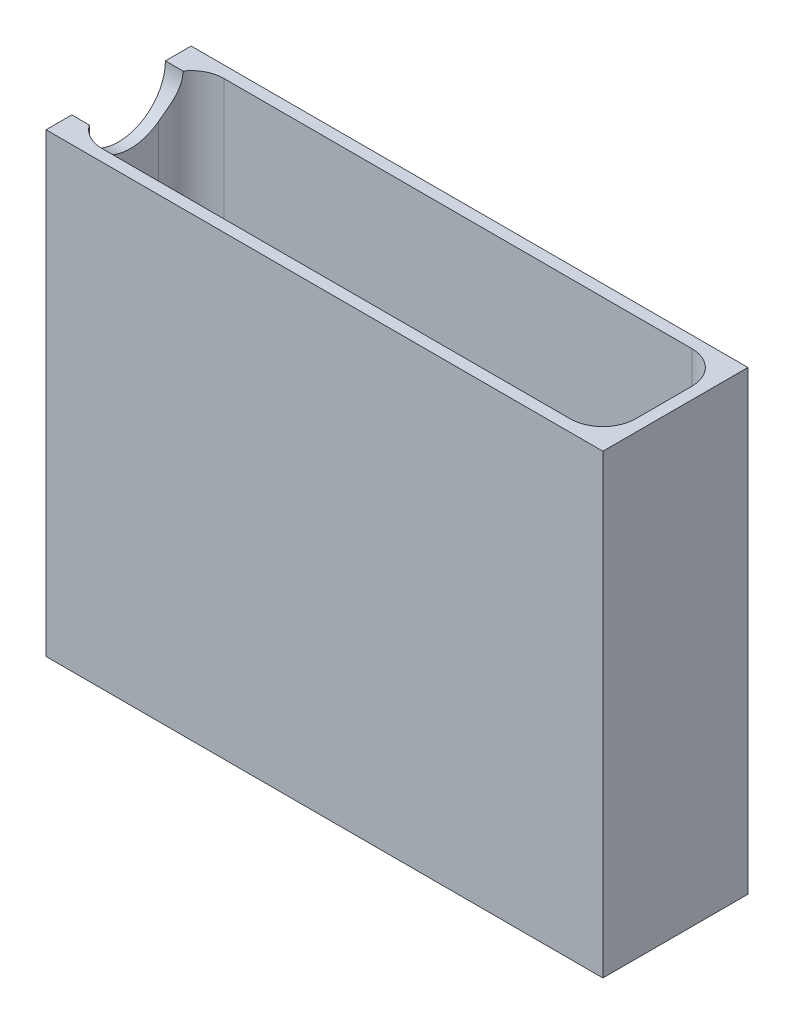
ISO-10303-21;
HEADER;
FILE_DESCRIPTION(('STEP AP214'),'2;1');
FILE_NAME('part.step','',(''),(''),'','','');
FILE_SCHEMA(('AUTOMOTIVE_DESIGN { 1 0 10303 214 1 1 1 1 }'));
ENDSEC;
DATA;
#1=APPLICATION_CONTEXT('core data for automotive mechanical design processes');
#2=APPLICATION_PROTOCOL_DEFINITION('international standard','automotive_design',2000,#1);
#3=PRODUCT_CONTEXT('',#1,'mechanical');
#4=PRODUCT('Part','Part','',(#3));
#5=PRODUCT_RELATED_PRODUCT_CATEGORY('part','',(#4));
#6=PRODUCT_DEFINITION_FORMATION('','',#4);
#7=PRODUCT_DEFINITION_CONTEXT('part definition',#1,'design');
#8=PRODUCT_DEFINITION('design','',#6,#7);
#9=PRODUCT_DEFINITION_SHAPE('','',#8);
#10=(LENGTH_UNIT() NAMED_UNIT(*) SI_UNIT(.MILLI.,.METRE.));
#11=(NAMED_UNIT(*) PLANE_ANGLE_UNIT() SI_UNIT($,.RADIAN.));
#12=(NAMED_UNIT(*) SI_UNIT($,.STERADIAN.) SOLID_ANGLE_UNIT());
#13=UNCERTAINTY_MEASURE_WITH_UNIT(LENGTH_MEASURE(1.E-05),#10,'distance_accuracy_value','');
#14=(GEOMETRIC_REPRESENTATION_CONTEXT(3) GLOBAL_UNCERTAINTY_ASSIGNED_CONTEXT((#13)) GLOBAL_UNIT_ASSIGNED_CONTEXT((#10,
#11,#12)) REPRESENTATION_CONTEXT('',''));
#15=CARTESIAN_POINT('',(0.,0.,0.));
#16=DIRECTION('',(0.,0.,1.));
#17=DIRECTION('',(1.,0.,0.));
#18=AXIS2_PLACEMENT_3D('',#15,#16,#17);
#19=CARTESIAN_POINT('',(0.,95.,0.));
#20=DIRECTION('',(0.,1.,0.));
#21=DIRECTION('',(0.,0.,1.));
#22=AXIS2_PLACEMENT_3D('',#19,#20,#21);
#23=PLANE('',#22);
#24=DIRECTION('',(1.,0.,0.));
#25=VECTOR('',#24,1.);
#26=CARTESIAN_POINT('',(0.,95.,26.));
#27=LINE('',#26,#25);
#28=CARTESIAN_POINT('',(-107.,95.,26.));
#29=VERTEX_POINT('',#28);
#30=CARTESIAN_POINT('',(-6.99999999999999,95.,26.));
#31=VERTEX_POINT('',#30);
#32=EDGE_CURVE('E198',#29,#31,#27,.T.);
#33=ORIENTED_EDGE('',*,*,#32,.F.);
#34=CARTESIAN_POINT('',(-107.,95.,19.));
#35=DIRECTION('',(0.,1.,0.));
#36=DIRECTION('',(0.,0.,1.));
#37=AXIS2_PLACEMENT_3D('',#34,#35,#36);
#38=CIRCLE('',#37,7.);
#39=CARTESIAN_POINT('',(-112.744562646538,95.,23.));
#40=VERTEX_POINT('',#39);
#41=EDGE_CURVE('E256',#29,#40,#38,.F.);
#42=ORIENTED_EDGE('',*,*,#41,.T.);
#43=DIRECTION('',(1.,0.,0.));
#44=VECTOR('',#43,1.);
#45=CARTESIAN_POINT('',(-461.417379105192,95.,23.));
#46=LINE('',#45,#44);
#47=CARTESIAN_POINT('',(-116.5,95.,23.));
#48=VERTEX_POINT('',#47);
#49=EDGE_CURVE('E80',#48,#40,#46,.T.);
#50=ORIENTED_EDGE('',*,*,#49,.F.);
#51=DIRECTION('',(0.,0.,1.));
#52=VECTOR('',#51,1.);
#53=CARTESIAN_POINT('',(-116.5,95.,0.));
#54=LINE('',#53,#52);
#55=CARTESIAN_POINT('',(-116.5,95.,28.5));
#56=VERTEX_POINT('',#55);
#57=EDGE_CURVE('E216',#48,#56,#54,.T.);
#58=ORIENTED_EDGE('',*,*,#57,.T.);
#59=DIRECTION('',(1.,0.,0.));
#60=VECTOR('',#59,1.);
#61=CARTESIAN_POINT('',(0.,95.,28.5));
#62=LINE('',#61,#60);
#63=CARTESIAN_POINT('',(2.5,95.,28.5));
#64=VERTEX_POINT('',#63);
#65=EDGE_CURVE('E218',#56,#64,#62,.T.);
#66=ORIENTED_EDGE('',*,*,#65,.T.);
#67=DIRECTION('',(0.,0.,-1.));
#68=VECTOR('',#67,1.);
#69=CARTESIAN_POINT('',(2.5,95.,0.));
#70=LINE('',#69,#68);
#71=CARTESIAN_POINT('',(2.5,95.,-2.5));
#72=VERTEX_POINT('',#71);
#73=EDGE_CURVE('E201',#64,#72,#70,.T.);
#74=ORIENTED_EDGE('',*,*,#73,.T.);
#75=DIRECTION('',(-1.,0.,0.));
#76=VECTOR('',#75,1.);
#77=CARTESIAN_POINT('',(0.,95.,-2.5));
#78=LINE('',#77,#76);
#79=CARTESIAN_POINT('',(-116.5,95.,-2.49999999999999));
#80=VERTEX_POINT('',#79);
#81=EDGE_CURVE('E214',#72,#80,#78,.T.);
#82=ORIENTED_EDGE('',*,*,#81,.T.);
#83=CARTESIAN_POINT('',(-116.5,95.,3.00000000000002));
#84=VERTEX_POINT('',#83);
#85=EDGE_CURVE('E166',#80,#84,#54,.T.);
#86=ORIENTED_EDGE('',*,*,#85,.T.);
#87=DIRECTION('',(1.,0.,0.));
#88=VECTOR('',#87,1.);
#89=CARTESIAN_POINT('',(-461.417379105192,95.,3.00000000000002));
#90=LINE('',#89,#88);
#91=CARTESIAN_POINT('',(-112.744562646538,95.,3.00000000000002));
#92=VERTEX_POINT('',#91);
#93=EDGE_CURVE('E72',#84,#92,#90,.T.);
#94=ORIENTED_EDGE('',*,*,#93,.T.);
#95=CARTESIAN_POINT('',(-107.,95.,7.00000000000001));
#96=DIRECTION('',(0.,1.,0.));
#97=DIRECTION('',(0.,0.,1.));
#98=AXIS2_PLACEMENT_3D('',#95,#96,#97);
#99=CIRCLE('',#98,7.);
#100=CARTESIAN_POINT('',(-107.,95.,0.));
#101=VERTEX_POINT('',#100);
#102=EDGE_CURVE('E12',#92,#101,#99,.F.);
#103=ORIENTED_EDGE('',*,*,#102,.T.);
#104=DIRECTION('',(-1.,0.,0.));
#105=VECTOR('',#104,1.);
#106=CARTESIAN_POINT('',(0.,95.,0.));
#107=LINE('',#106,#105);
#108=CARTESIAN_POINT('',(-7.,95.,0.));
#109=VERTEX_POINT('',#108);
#110=EDGE_CURVE('E194',#109,#101,#107,.T.);
#111=ORIENTED_EDGE('',*,*,#110,.F.);
#112=CARTESIAN_POINT('',(-7.,95.,7.));
#113=DIRECTION('',(0.,1.,0.));
#114=DIRECTION('',(0.,0.,1.));
#115=AXIS2_PLACEMENT_3D('',#112,#113,#114);
#116=CIRCLE('',#115,7.);
#117=CARTESIAN_POINT('',(0.,95.,7.));
#118=VERTEX_POINT('',#117);
#119=EDGE_CURVE('E254',#109,#118,#116,.F.);
#120=ORIENTED_EDGE('',*,*,#119,.T.);
#121=DIRECTION('',(0.,0.,-1.));
#122=VECTOR('',#121,1.);
#123=CARTESIAN_POINT('',(0.,95.,0.));
#124=LINE('',#123,#122);
#125=CARTESIAN_POINT('',(0.,95.,19.));
#126=VERTEX_POINT('',#125);
#127=EDGE_CURVE('E191',#126,#118,#124,.T.);
#128=ORIENTED_EDGE('',*,*,#127,.F.);
#129=CARTESIAN_POINT('',(-7.,95.,19.));
#130=DIRECTION('',(0.,1.,0.));
#131=DIRECTION('',(0.,0.,1.));
#132=AXIS2_PLACEMENT_3D('',#129,#130,#131);
#133=CIRCLE('',#132,7.);
#134=EDGE_CURVE('E252',#126,#31,#133,.F.);
#135=ORIENTED_EDGE('',*,*,#134,.T.);
#136=EDGE_LOOP('',(#33,#42,#50,#58,#66,#74,#82,#86,#94,#103,#111,#120,#128,#135));
#137=FACE_BOUND('',#136,.T.);
#138=ADVANCED_FACE('F57',(#137),#23,.T.);
#139=CARTESIAN_POINT('',(-116.5,95.,0.));
#140=DIRECTION('',(1.,0.,0.));
#141=DIRECTION('',(0.,0.,-1.));
#142=AXIS2_PLACEMENT_3D('',#139,#140,#141);
#143=PLANE('',#142);
#144=CARTESIAN_POINT('',(-116.5,95.,13.));
#145=DIRECTION('',(1.,0.,0.));
#146=DIRECTION('',(0.,0.,-1.));
#147=AXIS2_PLACEMENT_3D('',#144,#145,#146);
#148=CIRCLE('',#147,10.);
#149=EDGE_CURVE('E339',#48,#84,#148,.T.);
#150=ORIENTED_EDGE('',*,*,#149,.T.);
#151=ORIENTED_EDGE('',*,*,#85,.F.);
#152=DIRECTION('',(0.,-1.,0.));
#153=VECTOR('',#152,1.);
#154=CARTESIAN_POINT('',(-116.5,95.,-2.49999999999999));
#155=LINE('',#154,#153);
#156=CARTESIAN_POINT('',(-116.5,-2.5,-2.5));
#157=VERTEX_POINT('',#156);
#158=EDGE_CURVE('E160',#80,#157,#155,.T.);
#159=ORIENTED_EDGE('',*,*,#158,.T.);
#160=DIRECTION('',(0.,0.,-1.));
#161=VECTOR('',#160,1.);
#162=CARTESIAN_POINT('',(-116.5,-2.5,28.5));
#163=LINE('',#162,#161);
#164=CARTESIAN_POINT('',(-116.5,-2.5,28.5));
#165=VERTEX_POINT('',#164);
#166=EDGE_CURVE('E165',#165,#157,#163,.T.);
#167=ORIENTED_EDGE('',*,*,#166,.F.);
#168=DIRECTION('',(0.,-1.,0.));
#169=VECTOR('',#168,1.);
#170=CARTESIAN_POINT('',(-116.5,95.,28.5));
#171=LINE('',#170,#169);
#172=EDGE_CURVE('E169',#56,#165,#171,.T.);
#173=ORIENTED_EDGE('',*,*,#172,.F.);
#174=ORIENTED_EDGE('',*,*,#57,.F.);
#175=EDGE_LOOP('',(#150,#151,#159,#167,#173,#174));
#176=FACE_BOUND('',#175,.T.);
#177=ADVANCED_FACE('F162',(#176),#143,.F.);
#178=CARTESIAN_POINT('',(2.5,95.,0.));
#179=DIRECTION('',(-1.,0.,0.));
#180=DIRECTION('',(0.,0.,1.));
#181=AXIS2_PLACEMENT_3D('',#178,#179,#180);
#182=PLANE('',#181);
#183=DIRECTION('',(0.,-1.,0.));
#184=VECTOR('',#183,1.);
#185=CARTESIAN_POINT('',(2.5,95.,28.5));
#186=LINE('',#185,#184);
#187=CARTESIAN_POINT('',(2.5,-2.5,28.5));
#188=VERTEX_POINT('',#187);
#189=EDGE_CURVE('E220',#64,#188,#186,.T.);
#190=ORIENTED_EDGE('',*,*,#189,.T.);
#191=DIRECTION('',(0.,0.,1.));
#192=VECTOR('',#191,1.);
#193=CARTESIAN_POINT('',(2.5,-2.5,28.5));
#194=LINE('',#193,#192);
#195=CARTESIAN_POINT('',(2.5,-2.5,-2.5));
#196=VERTEX_POINT('',#195);
#197=EDGE_CURVE('E178',#196,#188,#194,.T.);
#198=ORIENTED_EDGE('',*,*,#197,.F.);
#199=DIRECTION('',(0.,-1.,0.));
#200=VECTOR('',#199,1.);
#201=CARTESIAN_POINT('',(2.5,95.,-2.5));
#202=LINE('',#201,#200);
#203=EDGE_CURVE('E168',#72,#196,#202,.T.);
#204=ORIENTED_EDGE('',*,*,#203,.F.);
#205=ORIENTED_EDGE('',*,*,#73,.F.);
#206=EDGE_LOOP('',(#190,#198,#204,#205));
#207=FACE_BOUND('',#206,.T.);
#208=ADVANCED_FACE('F307',(#207),#182,.F.);
#209=CARTESIAN_POINT('',(0.,95.,-2.5));
#210=DIRECTION('',(0.,0.,1.));
#211=DIRECTION('',(1.,0.,0.));
#212=AXIS2_PLACEMENT_3D('',#209,#210,#211);
#213=PLANE('',#212);
#214=ORIENTED_EDGE('',*,*,#203,.T.);
#215=DIRECTION('',(1.,0.,0.));
#216=VECTOR('',#215,1.);
#217=CARTESIAN_POINT('',(-116.5,-2.5,-2.5));
#218=LINE('',#217,#216);
#219=EDGE_CURVE('E172',#157,#196,#218,.T.);
#220=ORIENTED_EDGE('',*,*,#219,.F.);
#221=ORIENTED_EDGE('',*,*,#158,.F.);
#222=ORIENTED_EDGE('',*,*,#81,.F.);
#223=EDGE_LOOP('',(#214,#220,#221,#222));
#224=FACE_BOUND('',#223,.T.);
#225=ADVANCED_FACE('F173',(#224),#213,.F.);
#226=CARTESIAN_POINT('',(0.,95.,28.5));
#227=DIRECTION('',(0.,0.,-1.));
#228=DIRECTION('',(-1.,0.,0.));
#229=AXIS2_PLACEMENT_3D('',#226,#227,#228);
#230=PLANE('',#229);
#231=ORIENTED_EDGE('',*,*,#172,.T.);
#232=DIRECTION('',(-1.,0.,0.));
#233=VECTOR('',#232,1.);
#234=CARTESIAN_POINT('',(-116.5,-2.5,28.5));
#235=LINE('',#234,#233);
#236=EDGE_CURVE('E183',#188,#165,#235,.T.);
#237=ORIENTED_EDGE('',*,*,#236,.F.);
#238=ORIENTED_EDGE('',*,*,#189,.F.);
#239=ORIENTED_EDGE('',*,*,#65,.F.);
#240=EDGE_LOOP('',(#231,#237,#238,#239));
#241=FACE_BOUND('',#240,.T.);
#242=ADVANCED_FACE('F298',(#241),#230,.F.);
#243=CARTESIAN_POINT('',(0.,95.,0.));
#244=DIRECTION('',(-1.,0.,0.));
#245=DIRECTION('',(0.,0.,1.));
#246=AXIS2_PLACEMENT_3D('',#243,#244,#245);
#247=PLANE('',#246);
#248=DIRECTION('',(0.,0.,-1.));
#249=VECTOR('',#248,1.);
#250=CARTESIAN_POINT('',(0.,0.,0.));
#251=LINE('',#250,#249);
#252=CARTESIAN_POINT('',(0.,0.,19.));
#253=VERTEX_POINT('',#252);
#254=CARTESIAN_POINT('',(0.,0.,7.));
#255=VERTEX_POINT('',#254);
#256=EDGE_CURVE('E190',#253,#255,#251,.T.);
#257=ORIENTED_EDGE('',*,*,#256,.F.);
#258=DIRECTION('',(0.,-1.,0.));
#259=VECTOR('',#258,1.);
#260=CARTESIAN_POINT('',(0.,95.,19.));
#261=LINE('',#260,#259);
#262=EDGE_CURVE('E240',#253,#126,#261,.F.);
#263=ORIENTED_EDGE('',*,*,#262,.T.);
#264=ORIENTED_EDGE('',*,*,#127,.T.);
#265=DIRECTION('',(0.,-1.,0.));
#266=VECTOR('',#265,1.);
#267=CARTESIAN_POINT('',(0.,0.,7.));
#268=LINE('',#267,#266);
#269=EDGE_CURVE('E237',#118,#255,#268,.T.);
#270=ORIENTED_EDGE('',*,*,#269,.T.);
#271=EDGE_LOOP('',(#257,#263,#264,#270));
#272=FACE_BOUND('',#271,.T.);
#273=ADVANCED_FACE('F294',(#272),#247,.T.);
#274=CARTESIAN_POINT('',(0.,95.,0.));
#275=DIRECTION('',(0.,0.,1.));
#276=DIRECTION('',(1.,0.,0.));
#277=AXIS2_PLACEMENT_3D('',#274,#275,#276);
#278=PLANE('',#277);
#279=DIRECTION('',(-1.,0.,0.));
#280=VECTOR('',#279,1.);
#281=CARTESIAN_POINT('',(0.,0.,0.));
#282=LINE('',#281,#280);
#283=CARTESIAN_POINT('',(-7.,0.,0.));
#284=VERTEX_POINT('',#283);
#285=CARTESIAN_POINT('',(-107.,0.,0.));
#286=VERTEX_POINT('',#285);
#287=EDGE_CURVE('E204',#284,#286,#282,.T.);
#288=ORIENTED_EDGE('',*,*,#287,.F.);
#289=DIRECTION('',(0.,-1.,0.));
#290=VECTOR('',#289,1.);
#291=CARTESIAN_POINT('',(-7.,95.,0.));
#292=LINE('',#291,#290);
#293=EDGE_CURVE('E245',#284,#109,#292,.F.);
#294=ORIENTED_EDGE('',*,*,#293,.T.);
#295=ORIENTED_EDGE('',*,*,#110,.T.);
#296=DIRECTION('',(0.,-1.,0.));
#297=VECTOR('',#296,1.);
#298=CARTESIAN_POINT('',(-107.,0.,0.));
#299=LINE('',#298,#297);
#300=EDGE_CURVE('E242',#101,#286,#299,.T.);
#301=ORIENTED_EDGE('',*,*,#300,.T.);
#302=EDGE_LOOP('',(#288,#294,#295,#301));
#303=FACE_BOUND('',#302,.T.);
#304=ADVANCED_FACE('F290',(#303),#278,.T.);
#305=CARTESIAN_POINT('',(-114.,95.,0.));
#306=DIRECTION('',(1.,0.,0.));
#307=DIRECTION('',(0.,0.,-1.));
#308=AXIS2_PLACEMENT_3D('',#305,#306,#307);
#309=PLANE('',#308);
#310=CARTESIAN_POINT('',(-114.,95.,13.));
#311=DIRECTION('',(1.,0.,0.));
#312=DIRECTION('',(0.,0.,-1.));
#313=AXIS2_PLACEMENT_3D('',#310,#311,#312);
#314=CIRCLE('',#313,10.);
#315=CARTESIAN_POINT('',(-114.,87.,19.));
#316=VERTEX_POINT('',#315);
#317=CARTESIAN_POINT('',(-114.,87.,7.00000000000001));
#318=VERTEX_POINT('',#317);
#319=EDGE_CURVE('E338',#316,#318,#314,.T.);
#320=ORIENTED_EDGE('',*,*,#319,.F.);
#321=DIRECTION('',(0.,-1.,0.));
#322=VECTOR('',#321,1.);
#323=CARTESIAN_POINT('',(-114.,0.,19.));
#324=LINE('',#323,#322);
#325=CARTESIAN_POINT('',(-114.,0.,19.));
#326=VERTEX_POINT('',#325);
#327=EDGE_CURVE('E249',#316,#326,#324,.T.);
#328=ORIENTED_EDGE('',*,*,#327,.T.);
#329=DIRECTION('',(0.,0.,1.));
#330=VECTOR('',#329,1.);
#331=CARTESIAN_POINT('',(-114.,0.,0.));
#332=LINE('',#331,#330);
#333=CARTESIAN_POINT('',(-114.,0.,7.00000000000001));
#334=VERTEX_POINT('',#333);
#335=EDGE_CURVE('E207',#334,#326,#332,.T.);
#336=ORIENTED_EDGE('',*,*,#335,.F.);
#337=DIRECTION('',(0.,-1.,0.));
#338=VECTOR('',#337,1.);
#339=CARTESIAN_POINT('',(-114.,95.,7.00000000000001));
#340=LINE('',#339,#338);
#341=EDGE_CURVE('E247',#334,#318,#340,.F.);
#342=ORIENTED_EDGE('',*,*,#341,.T.);
#343=EDGE_LOOP('',(#320,#328,#336,#342));
#344=FACE_BOUND('',#343,.T.);
#345=ADVANCED_FACE('F286',(#344),#309,.T.);
#346=CARTESIAN_POINT('',(0.,95.,26.));
#347=DIRECTION('',(0.,0.,-1.));
#348=DIRECTION('',(-1.,0.,0.));
#349=AXIS2_PLACEMENT_3D('',#346,#347,#348);
#350=PLANE('',#349);
#351=ORIENTED_EDGE('',*,*,#32,.T.);
#352=DIRECTION('',(0.,-1.,0.));
#353=VECTOR('',#352,1.);
#354=CARTESIAN_POINT('',(-7.,0.,26.));
#355=LINE('',#354,#353);
#356=CARTESIAN_POINT('',(-6.99999999999999,0.,26.));
#357=VERTEX_POINT('',#356);
#358=EDGE_CURVE('E226',#31,#357,#355,.T.);
#359=ORIENTED_EDGE('',*,*,#358,.T.);
#360=DIRECTION('',(1.,0.,0.));
#361=VECTOR('',#360,1.);
#362=CARTESIAN_POINT('',(0.,0.,26.));
#363=LINE('',#362,#361);
#364=CARTESIAN_POINT('',(-107.,0.,26.));
#365=VERTEX_POINT('',#364);
#366=EDGE_CURVE('E195',#365,#357,#363,.T.);
#367=ORIENTED_EDGE('',*,*,#366,.F.);
#368=DIRECTION('',(0.,-1.,0.));
#369=VECTOR('',#368,1.);
#370=CARTESIAN_POINT('',(-107.,95.,26.));
#371=LINE('',#370,#369);
#372=EDGE_CURVE('E224',#365,#29,#371,.F.);
#373=ORIENTED_EDGE('',*,*,#372,.T.);
#374=EDGE_LOOP('',(#351,#359,#367,#373));
#375=FACE_BOUND('',#374,.T.);
#376=ADVANCED_FACE('F282',(#375),#350,.T.);
#377=CARTESIAN_POINT('',(0.,0.,0.));
#378=DIRECTION('',(0.,-1.,0.));
#379=DIRECTION('',(0.,0.,-1.));
#380=AXIS2_PLACEMENT_3D('',#377,#378,#379);
#381=PLANE('',#380);
#382=ORIENTED_EDGE('',*,*,#366,.T.);
#383=CARTESIAN_POINT('',(-7.,0.,19.));
#384=DIRECTION('',(0.,-1.,0.));
#385=DIRECTION('',(0.,0.,-1.));
#386=AXIS2_PLACEMENT_3D('',#383,#384,#385);
#387=CIRCLE('',#386,7.);
#388=EDGE_CURVE('E235',#357,#253,#387,.F.);
#389=ORIENTED_EDGE('',*,*,#388,.T.);
#390=ORIENTED_EDGE('',*,*,#256,.T.);
#391=CARTESIAN_POINT('',(-7.,0.,7.));
#392=DIRECTION('',(0.,-1.,0.));
#393=DIRECTION('',(0.,0.,-1.));
#394=AXIS2_PLACEMENT_3D('',#391,#392,#393);
#395=CIRCLE('',#394,7.);
#396=EDGE_CURVE('E233',#255,#284,#395,.F.);
#397=ORIENTED_EDGE('',*,*,#396,.T.);
#398=ORIENTED_EDGE('',*,*,#287,.T.);
#399=CARTESIAN_POINT('',(-107.,0.,7.00000000000001));
#400=DIRECTION('',(0.,-1.,0.));
#401=DIRECTION('',(0.,0.,-1.));
#402=AXIS2_PLACEMENT_3D('',#399,#400,#401);
#403=CIRCLE('',#402,7.);
#404=EDGE_CURVE('E229',#286,#334,#403,.F.);
#405=ORIENTED_EDGE('',*,*,#404,.T.);
#406=ORIENTED_EDGE('',*,*,#335,.T.);
#407=CARTESIAN_POINT('',(-107.,0.,19.));
#408=DIRECTION('',(0.,-1.,0.));
#409=DIRECTION('',(0.,0.,-1.));
#410=AXIS2_PLACEMENT_3D('',#407,#408,#409);
#411=CIRCLE('',#410,7.);
#412=EDGE_CURVE('E231',#326,#365,#411,.F.);
#413=ORIENTED_EDGE('',*,*,#412,.T.);
#414=EDGE_LOOP('',(#382,#389,#390,#397,#398,#405,#406,#413));
#415=FACE_BOUND('',#414,.T.);
#416=ADVANCED_FACE('F279',(#415),#381,.F.);
#417=CARTESIAN_POINT('',(0.,-2.5,0.));
#418=DIRECTION('',(0.,-1.,0.));
#419=DIRECTION('',(0.,0.,-1.));
#420=AXIS2_PLACEMENT_3D('',#417,#418,#419);
#421=PLANE('',#420);
#422=ORIENTED_EDGE('',*,*,#166,.T.);
#423=ORIENTED_EDGE('',*,*,#219,.T.);
#424=ORIENTED_EDGE('',*,*,#197,.T.);
#425=ORIENTED_EDGE('',*,*,#236,.T.);
#426=EDGE_LOOP('',(#422,#423,#424,#425));
#427=FACE_BOUND('',#426,.T.);
#428=ADVANCED_FACE('F181',(#427),#421,.T.);
#429=CARTESIAN_POINT('',(-461.417379105192,95.,13.));
#430=DIRECTION('',(1.,0.,0.));
#431=DIRECTION('',(0.,0.,-1.));
#432=AXIS2_PLACEMENT_3D('',#429,#430,#431);
#433=CYLINDRICAL_SURFACE('',#432,10.);
#434=ORIENTED_EDGE('',*,*,#149,.F.);
#435=ORIENTED_EDGE('',*,*,#49,.T.);
#436=CARTESIAN_POINT('',(-112.744562646538,95.,23.));
#437=CARTESIAN_POINT('',(-112.744554613015,94.8740067923568,23.0000013321702));
#438=CARTESIAN_POINT('',(-112.746221814842,94.7480320497014,22.9976183419877));
#439=CARTESIAN_POINT('',(-112.752832720464,94.4963597123054,22.9881029657639));
#440=CARTESIAN_POINT('',(-112.757776115849,94.370662092595,22.9809710267717));
#441=CARTESIAN_POINT('',(-112.777391746881,93.9946621663622,22.9525066711028));
#442=CARTESIAN_POINT('',(-112.79684983229,93.7450974305953,22.9241055938798));
#443=CARTESIAN_POINT('',(-112.846937370497,93.2513002085023,22.8490674982103));
#444=CARTESIAN_POINT('',(-112.877507111342,93.0070464816555,22.8025278581904));
#445=CARTESIAN_POINT('',(-112.947706382334,92.5238590798692,22.691758353563));
#446=CARTESIAN_POINT('',(-112.987338538674,92.2849269691475,22.6275233599203));
#447=CARTESIAN_POINT('',(-113.072971766477,91.8145255960047,22.4822526946208));
#448=CARTESIAN_POINT('',(-113.118946268098,91.5830299243947,22.4012864446821));
#449=CARTESIAN_POINT('',(-113.214742980406,91.1273240970401,22.2229198876034));
#450=CARTESIAN_POINT('',(-113.264564823142,90.9031132474974,22.1255211509781));
#451=CARTESIAN_POINT('',(-113.365423296726,90.4624774716424,21.9146278617004));
#452=CARTESIAN_POINT('',(-113.416460761052,90.2460581586973,21.8011219845924));
#453=CARTESIAN_POINT('',(-113.517048736336,89.8217989557864,21.5583865829545));
#454=CARTESIAN_POINT('',(-113.566598910738,89.613961003747,21.4291535324916));
#455=CARTESIAN_POINT('',(-113.667327902099,89.1827528707463,21.1385039972514));
#456=CARTESIAN_POINT('',(-113.717962940219,88.9605979350248,20.9750843589513));
#457=CARTESIAN_POINT('',(-113.810049397547,88.529502788679,20.6294797203548));
#458=CARTESIAN_POINT('',(-113.851505014168,88.3205565695523,20.4473033528839));
#459=CARTESIAN_POINT('',(-113.921400039458,87.9164670001047,20.0640880503133));
#460=CARTESIAN_POINT('',(-113.949783702462,87.7213857109093,19.8629726570449));
#461=CARTESIAN_POINT('',(-113.9792608037,87.4412437853307,19.5486628279545));
#462=CARTESIAN_POINT('',(-113.986904633927,87.3498476029007,19.4416595451232));
#463=CARTESIAN_POINT('',(-113.997274930465,87.1715118311084,19.2237139684338));
#464=CARTESIAN_POINT('',(-113.999999709197,87.0845737811323,19.1127703360649));
#465=CARTESIAN_POINT('',(-114.,87.,19.));
#466=B_SPLINE_CURVE_WITH_KNOTS('',3,(#436,#437,#438,#439,#440,#441,#442,#443,#444,#445,#446,
#447,#448,#449,#450,#451,#452,#453,#454,#455,#456,#457,#458,#459,#460,#461,#462,#463,#464,#465),
.UNSPECIFIED.,.F.,.F.,(4,2,2,2,2,2,2,2,2,2,2,2,2,2,4),(0.,0.377910108083715,0.75578464608527,
1.51047167522261,2.26116170681237,3.01206955683396,3.75992212596951,4.50770326045754,
5.256012766858,6.00449034967065,6.84463686941822,7.68439842394454,8.52770873612221,
8.95031356926342,9.37306335792787),.UNSPECIFIED.);
#467=EDGE_CURVE('E258',#40,#316,#466,.T.);
#468=ORIENTED_EDGE('',*,*,#467,.T.);
#469=ORIENTED_EDGE('',*,*,#319,.T.);
#470=CARTESIAN_POINT('',(-114.,87.,7.00000000000001));
#471=CARTESIAN_POINT('',(-113.999999839104,87.0749823285643,6.9000202500116));
#472=CARTESIAN_POINT('',(-113.997857988542,87.151825041698,6.80147187882503));
#473=CARTESIAN_POINT('',(-113.989658481764,87.3090454387297,6.60744183850228));
#474=CARTESIAN_POINT('',(-113.983601784852,87.3894222521265,6.51195942409076));
#475=CARTESIAN_POINT('',(-113.960136712399,87.6353393447811,6.23067892314439));
#476=CARTESIAN_POINT('',(-113.93743071771,87.8059346177103,6.04969013299664));
#477=CARTESIAN_POINT('',(-113.880951496933,88.1583237426742,5.70257470121504));
#478=CARTESIAN_POINT('',(-113.847226947257,88.3400655353569,5.53638671098206));
#479=CARTESIAN_POINT('',(-113.771497266188,88.7143389055961,5.21856308805064));
#480=CARTESIAN_POINT('',(-113.729488641452,88.906875010447,5.06693363484249));
#481=CARTESIAN_POINT('',(-113.640198465047,89.3005506947998,4.77957778589246));
#482=CARTESIAN_POINT('',(-113.592948160316,89.501635304816,4.6437660972167));
#483=CARTESIAN_POINT('',(-113.495621557033,89.9125928609527,4.38739673949106));
#484=CARTESIAN_POINT('',(-113.445545681071,90.1224644916861,4.2668367980959));
#485=CARTESIAN_POINT('',(-113.345144562478,90.5504209533427,4.04121774399461));
#486=CARTESIAN_POINT('',(-113.294819239142,90.7685086166257,3.93616403937072));
#487=CARTESIAN_POINT('',(-113.196529574394,91.2122269017024,3.74195294670818));
#488=CARTESIAN_POINT('',(-113.148565727691,91.4378590875284,3.652798879343));
#489=CARTESIAN_POINT('',(-113.05076693794,91.9303595229301,3.47868744977178));
#490=CARTESIAN_POINT('',(-113.001733900002,92.1983292997348,3.3963739200514));
#491=CARTESIAN_POINT('',(-112.914085746235,92.7418413106751,3.25425589383896));
#492=CARTESIAN_POINT('',(-112.875467290526,93.0173810858593,3.19444417874437));
#493=CARTESIAN_POINT('',(-112.827754289026,93.4356094843781,3.12210138474743));
#494=CARTESIAN_POINT('',(-112.813525776718,93.5762593838655,3.10084628815908));
#495=CARTESIAN_POINT('',(-112.788864316479,93.8586749435259,3.06432479662929));
#496=CARTESIAN_POINT('',(-112.778431264863,94.0004405731113,3.04905823809291));
#497=CARTESIAN_POINT('',(-112.761615577918,94.2849646780481,3.02457317948688));
#498=CARTESIAN_POINT('',(-112.755239536294,94.4277243903672,3.01536452428144));
#499=CARTESIAN_POINT('',(-112.746703274701,94.7136540209333,3.00307475147487));
#500=CARTESIAN_POINT('',(-112.744543695259,94.8568239981964,2.99999456485691));
#501=CARTESIAN_POINT('',(-112.744562646538,95.,3.00000000000002));
#502=B_SPLINE_CURVE_WITH_KNOTS('',3,(#470,#471,#472,#473,#474,#475,#476,#477,#478,#479,#480,
#481,#482,#483,#484,#485,#486,#487,#488,#489,#490,#491,#492,#493,#494,#495,#496,#497,#498,#499,
#500,#501),.UNSPECIFIED.,.F.,.F.,(4,2,2,2,2,2,2,2,2,2,2,2,2,2,2,4),(0.,0.37482872922325,
0.749565644195698,1.49770411744561,2.2425812613454,2.98777318953257,3.72874002038631,
4.4695963248601,5.21071040899196,5.95197909559047,6.80463820636224,7.65702354959779,
8.08574351105406,8.5144517599191,8.94385500436363,9.37332347500157),.UNSPECIFIED.);
#503=EDGE_CURVE('E66',#318,#92,#502,.T.);
#504=ORIENTED_EDGE('',*,*,#503,.T.);
#505=ORIENTED_EDGE('',*,*,#93,.F.);
#506=EDGE_LOOP('',(#434,#435,#468,#469,#504,#505));
#507=FACE_BOUND('',#506,.T.);
#508=ADVANCED_FACE('F271',(#507),#433,.F.);
#509=CARTESIAN_POINT('',(-7.,95.,19.));
#510=DIRECTION('',(0.,1.,0.));
#511=DIRECTION('',(0.,0.,1.));
#512=AXIS2_PLACEMENT_3D('',#509,#510,#511);
#513=CYLINDRICAL_SURFACE('',#512,7.);
#514=ORIENTED_EDGE('',*,*,#134,.F.);
#515=ORIENTED_EDGE('',*,*,#262,.F.);
#516=ORIENTED_EDGE('',*,*,#388,.F.);
#517=ORIENTED_EDGE('',*,*,#358,.F.);
#518=EDGE_LOOP('',(#514,#515,#516,#517));
#519=FACE_BOUND('',#518,.T.);
#520=ADVANCED_FACE('F275',(#519),#513,.F.);
#521=CARTESIAN_POINT('',(-7.,95.,7.));
#522=DIRECTION('',(0.,1.,0.));
#523=DIRECTION('',(0.,0.,1.));
#524=AXIS2_PLACEMENT_3D('',#521,#522,#523);
#525=CYLINDRICAL_SURFACE('',#524,7.);
#526=ORIENTED_EDGE('',*,*,#119,.F.);
#527=ORIENTED_EDGE('',*,*,#293,.F.);
#528=ORIENTED_EDGE('',*,*,#396,.F.);
#529=ORIENTED_EDGE('',*,*,#269,.F.);
#530=EDGE_LOOP('',(#526,#527,#528,#529));
#531=FACE_BOUND('',#530,.T.);
#532=ADVANCED_FACE('F314',(#531),#525,.F.);
#533=CARTESIAN_POINT('',(-107.,95.,19.));
#534=DIRECTION('',(0.,1.,0.));
#535=DIRECTION('',(0.,0.,1.));
#536=AXIS2_PLACEMENT_3D('',#533,#534,#535);
#537=CYLINDRICAL_SURFACE('',#536,7.);
#538=ORIENTED_EDGE('',*,*,#41,.F.);
#539=ORIENTED_EDGE('',*,*,#372,.F.);
#540=ORIENTED_EDGE('',*,*,#412,.F.);
#541=ORIENTED_EDGE('',*,*,#327,.F.);
#542=ORIENTED_EDGE('',*,*,#467,.F.);
#543=EDGE_LOOP('',(#538,#539,#540,#541,#542));
#544=FACE_BOUND('',#543,.T.);
#545=ADVANCED_FACE('F268',(#544),#537,.F.);
#546=CARTESIAN_POINT('',(-107.,95.,7.00000000000001));
#547=DIRECTION('',(0.,1.,0.));
#548=DIRECTION('',(0.,0.,1.));
#549=AXIS2_PLACEMENT_3D('',#546,#547,#548);
#550=CYLINDRICAL_SURFACE('',#549,7.);
#551=ORIENTED_EDGE('',*,*,#503,.F.);
#552=ORIENTED_EDGE('',*,*,#341,.F.);
#553=ORIENTED_EDGE('',*,*,#404,.F.);
#554=ORIENTED_EDGE('',*,*,#300,.F.);
#555=ORIENTED_EDGE('',*,*,#102,.F.);
#556=EDGE_LOOP('',(#551,#552,#553,#554,#555));
#557=FACE_BOUND('',#556,.T.);
#558=ADVANCED_FACE('F59',(#557),#550,.F.);
#559=CLOSED_SHELL('',(#138,#177,#208,#225,#242,#273,#304,#345,#376,#416,#428,#508,#520,#532,
#545,#558));
#560=MANIFOLD_SOLID_BREP('B2',#559);
#561=ADVANCED_BREP_SHAPE_REPRESENTATION('',(#18,#560),#14);
#562=SHAPE_DEFINITION_REPRESENTATION(#9,#561);
ENDSEC;
END-ISO-10303-21;
